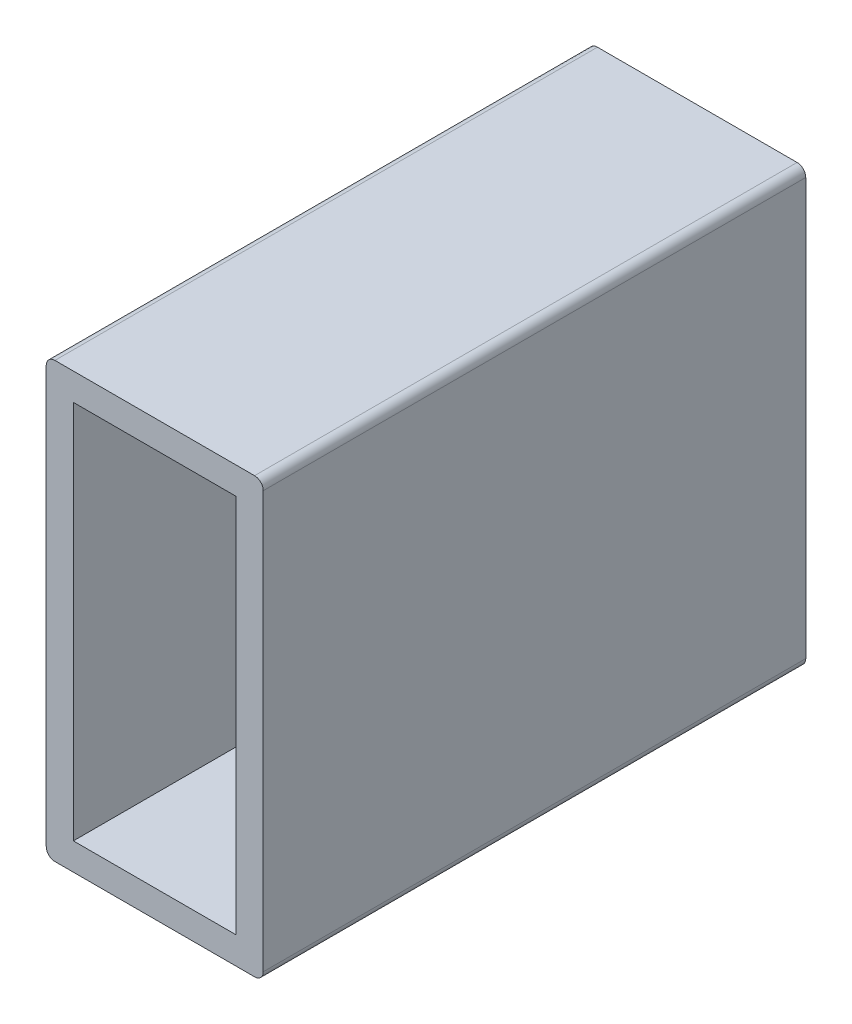
ISO-10303-21;
HEADER;
FILE_DESCRIPTION(('STEP AP214'),'2;1');
FILE_NAME('part.step','',(''),(''),'','','');
FILE_SCHEMA(('AUTOMOTIVE_DESIGN { 1 0 10303 214 1 1 1 1 }'));
ENDSEC;
DATA;
#1=APPLICATION_CONTEXT('core data for automotive mechanical design processes');
#2=APPLICATION_PROTOCOL_DEFINITION('international standard','automotive_design',2000,#1);
#3=PRODUCT_CONTEXT('',#1,'mechanical');
#4=PRODUCT('Part','Part','',(#3));
#5=PRODUCT_RELATED_PRODUCT_CATEGORY('part','',(#4));
#6=PRODUCT_DEFINITION_FORMATION('','',#4);
#7=PRODUCT_DEFINITION_CONTEXT('part definition',#1,'design');
#8=PRODUCT_DEFINITION('design','',#6,#7);
#9=PRODUCT_DEFINITION_SHAPE('','',#8);
#10=(LENGTH_UNIT() NAMED_UNIT(*) SI_UNIT(.MILLI.,.METRE.));
#11=(NAMED_UNIT(*) PLANE_ANGLE_UNIT() SI_UNIT($,.RADIAN.));
#12=(NAMED_UNIT(*) SI_UNIT($,.STERADIAN.) SOLID_ANGLE_UNIT());
#13=UNCERTAINTY_MEASURE_WITH_UNIT(LENGTH_MEASURE(1.E-05),#10,'distance_accuracy_value','');
#14=(GEOMETRIC_REPRESENTATION_CONTEXT(3) GLOBAL_UNCERTAINTY_ASSIGNED_CONTEXT((#13)) GLOBAL_UNIT_ASSIGNED_CONTEXT((#10,
#11,#12)) REPRESENTATION_CONTEXT('',''));
#15=CARTESIAN_POINT('',(0.,0.,0.));
#16=DIRECTION('',(0.,0.,1.));
#17=DIRECTION('',(1.,0.,0.));
#18=AXIS2_PLACEMENT_3D('',#15,#16,#17);
#19=CARTESIAN_POINT('',(-11.684,-24.384,31.75));
#20=DIRECTION('',(0.,0.,1.));
#21=DIRECTION('',(1.,0.,0.));
#22=AXIS2_PLACEMENT_3D('',#19,#20,#21);
#23=PLANE('',#22);
#24=CARTESIAN_POINT('',(-11.684,-24.384,31.75));
#25=DIRECTION('',(0.,0.,1.));
#26=DIRECTION('',(1.,0.,0.));
#27=AXIS2_PLACEMENT_3D('',#24,#25,#26);
#28=CIRCLE('',#27,1.016);
#29=CARTESIAN_POINT('',(-12.7,-24.384,31.75));
#30=VERTEX_POINT('',#29);
#31=CARTESIAN_POINT('',(-11.684,-25.4,31.75));
#32=VERTEX_POINT('',#31);
#33=EDGE_CURVE('E157',#30,#32,#28,.T.);
#34=ORIENTED_EDGE('',*,*,#33,.T.);
#35=DIRECTION('',(1.,0.,0.));
#36=VECTOR('',#35,1.);
#37=CARTESIAN_POINT('',(-11.684,-25.4,31.75));
#38=LINE('',#37,#36);
#39=CARTESIAN_POINT('',(11.684,-25.4,31.75));
#40=VERTEX_POINT('',#39);
#41=EDGE_CURVE('E160',#32,#40,#38,.T.);
#42=ORIENTED_EDGE('',*,*,#41,.T.);
#43=CARTESIAN_POINT('',(11.684,-24.384,31.75));
#44=DIRECTION('',(0.,0.,1.));
#45=DIRECTION('',(1.,0.,0.));
#46=AXIS2_PLACEMENT_3D('',#43,#44,#45);
#47=CIRCLE('',#46,1.016);
#48=CARTESIAN_POINT('',(12.7,-24.384,31.75));
#49=VERTEX_POINT('',#48);
#50=EDGE_CURVE('E163',#40,#49,#47,.T.);
#51=ORIENTED_EDGE('',*,*,#50,.T.);
#52=DIRECTION('',(0.,1.,0.));
#53=VECTOR('',#52,1.);
#54=CARTESIAN_POINT('',(12.7,-24.384,31.75));
#55=LINE('',#54,#53);
#56=CARTESIAN_POINT('',(12.7,24.384,31.75));
#57=VERTEX_POINT('',#56);
#58=EDGE_CURVE('E165',#49,#57,#55,.T.);
#59=ORIENTED_EDGE('',*,*,#58,.T.);
#60=CARTESIAN_POINT('',(11.684,24.384,31.75));
#61=DIRECTION('',(0.,0.,1.));
#62=DIRECTION('',(1.,0.,0.));
#63=AXIS2_PLACEMENT_3D('',#60,#61,#62);
#64=CIRCLE('',#63,1.016);
#65=CARTESIAN_POINT('',(11.684,25.4,31.75));
#66=VERTEX_POINT('',#65);
#67=EDGE_CURVE('E167',#57,#66,#64,.T.);
#68=ORIENTED_EDGE('',*,*,#67,.T.);
#69=DIRECTION('',(-1.,0.,0.));
#70=VECTOR('',#69,1.);
#71=CARTESIAN_POINT('',(-11.684,25.4,31.75));
#72=LINE('',#71,#70);
#73=CARTESIAN_POINT('',(-11.684,25.4,31.75));
#74=VERTEX_POINT('',#73);
#75=EDGE_CURVE('E169',#66,#74,#72,.T.);
#76=ORIENTED_EDGE('',*,*,#75,.T.);
#77=CARTESIAN_POINT('',(-11.684,24.384,31.75));
#78=DIRECTION('',(0.,0.,1.));
#79=DIRECTION('',(1.,0.,0.));
#80=AXIS2_PLACEMENT_3D('',#77,#78,#79);
#81=CIRCLE('',#80,1.016);
#82=CARTESIAN_POINT('',(-12.7,24.384,31.75));
#83=VERTEX_POINT('',#82);
#84=EDGE_CURVE('E171',#74,#83,#81,.T.);
#85=ORIENTED_EDGE('',*,*,#84,.T.);
#86=DIRECTION('',(0.,-1.,0.));
#87=VECTOR('',#86,1.);
#88=CARTESIAN_POINT('',(-12.7,-24.384,31.75));
#89=LINE('',#88,#87);
#90=EDGE_CURVE('E173',#83,#30,#89,.T.);
#91=ORIENTED_EDGE('',*,*,#90,.T.);
#92=EDGE_LOOP('',(#34,#42,#51,#59,#68,#76,#85,#91));
#93=FACE_BOUND('',#92,.T.);
#94=DIRECTION('',(1.,0.,0.));
#95=VECTOR('',#94,1.);
#96=CARTESIAN_POINT('',(-9.525,-22.225,31.75));
#97=LINE('',#96,#95);
#98=CARTESIAN_POINT('',(-9.525,-22.225,31.75));
#99=VERTEX_POINT('',#98);
#100=CARTESIAN_POINT('',(9.525,-22.225,31.75));
#101=VERTEX_POINT('',#100);
#102=EDGE_CURVE('E129',#99,#101,#97,.T.);
#103=ORIENTED_EDGE('',*,*,#102,.F.);
#104=DIRECTION('',(0.,-1.,0.));
#105=VECTOR('',#104,1.);
#106=CARTESIAN_POINT('',(-9.525,-22.225,31.75));
#107=LINE('',#106,#105);
#108=CARTESIAN_POINT('',(-9.525,22.225,31.75));
#109=VERTEX_POINT('',#108);
#110=EDGE_CURVE('E121',#109,#99,#107,.T.);
#111=ORIENTED_EDGE('',*,*,#110,.F.);
#112=DIRECTION('',(-1.,0.,0.));
#113=VECTOR('',#112,1.);
#114=CARTESIAN_POINT('',(-9.525,22.225,31.75));
#115=LINE('',#114,#113);
#116=CARTESIAN_POINT('',(9.525,22.225,31.75));
#117=VERTEX_POINT('',#116);
#118=EDGE_CURVE('E143',#117,#109,#115,.T.);
#119=ORIENTED_EDGE('',*,*,#118,.F.);
#120=DIRECTION('',(0.,1.,0.));
#121=VECTOR('',#120,1.);
#122=CARTESIAN_POINT('',(9.525,-22.225,31.75));
#123=LINE('',#122,#121);
#124=EDGE_CURVE('E141',#101,#117,#123,.T.);
#125=ORIENTED_EDGE('',*,*,#124,.F.);
#126=EDGE_LOOP('',(#103,#111,#119,#125));
#127=FACE_BOUND('',#126,.T.);
#128=ADVANCED_FACE('F32',(#93,#127),#23,.T.);
#129=CARTESIAN_POINT('',(-11.684,-24.384,-31.75));
#130=DIRECTION('',(0.,0.,1.));
#131=DIRECTION('',(1.,0.,0.));
#132=AXIS2_PLACEMENT_3D('',#129,#130,#131);
#133=PLANE('',#132);
#134=CARTESIAN_POINT('',(-11.684,-24.384,-31.75));
#135=DIRECTION('',(0.,0.,1.));
#136=DIRECTION('',(1.,0.,0.));
#137=AXIS2_PLACEMENT_3D('',#134,#135,#136);
#138=CIRCLE('',#137,1.016);
#139=CARTESIAN_POINT('',(-12.7,-24.384,-31.75));
#140=VERTEX_POINT('',#139);
#141=CARTESIAN_POINT('',(-11.684,-25.4,-31.75));
#142=VERTEX_POINT('',#141);
#143=EDGE_CURVE('E137',#140,#142,#138,.T.);
#144=ORIENTED_EDGE('',*,*,#143,.F.);
#145=DIRECTION('',(0.,-1.,0.));
#146=VECTOR('',#145,1.);
#147=CARTESIAN_POINT('',(-12.7,-24.384,-31.75));
#148=LINE('',#147,#146);
#149=CARTESIAN_POINT('',(-12.7,24.384,-31.75));
#150=VERTEX_POINT('',#149);
#151=EDGE_CURVE('E161',#150,#140,#148,.T.);
#152=ORIENTED_EDGE('',*,*,#151,.F.);
#153=CARTESIAN_POINT('',(-11.684,24.384,-31.75));
#154=DIRECTION('',(0.,0.,1.));
#155=DIRECTION('',(1.,0.,0.));
#156=AXIS2_PLACEMENT_3D('',#153,#154,#155);
#157=CIRCLE('',#156,1.016);
#158=CARTESIAN_POINT('',(-11.684,25.4,-31.75));
#159=VERTEX_POINT('',#158);
#160=EDGE_CURVE('E188',#159,#150,#157,.T.);
#161=ORIENTED_EDGE('',*,*,#160,.F.);
#162=DIRECTION('',(-1.,0.,0.));
#163=VECTOR('',#162,1.);
#164=CARTESIAN_POINT('',(-11.684,25.4,-31.75));
#165=LINE('',#164,#163);
#166=CARTESIAN_POINT('',(11.684,25.4,-31.75));
#167=VERTEX_POINT('',#166);
#168=EDGE_CURVE('E186',#167,#159,#165,.T.);
#169=ORIENTED_EDGE('',*,*,#168,.F.);
#170=CARTESIAN_POINT('',(11.684,24.384,-31.75));
#171=DIRECTION('',(0.,0.,1.));
#172=DIRECTION('',(1.,0.,0.));
#173=AXIS2_PLACEMENT_3D('',#170,#171,#172);
#174=CIRCLE('',#173,1.016);
#175=CARTESIAN_POINT('',(12.7,24.384,-31.75));
#176=VERTEX_POINT('',#175);
#177=EDGE_CURVE('E184',#176,#167,#174,.T.);
#178=ORIENTED_EDGE('',*,*,#177,.F.);
#179=DIRECTION('',(0.,1.,0.));
#180=VECTOR('',#179,1.);
#181=CARTESIAN_POINT('',(12.7,-24.384,-31.75));
#182=LINE('',#181,#180);
#183=CARTESIAN_POINT('',(12.7,-24.384,-31.75));
#184=VERTEX_POINT('',#183);
#185=EDGE_CURVE('E182',#184,#176,#182,.T.);
#186=ORIENTED_EDGE('',*,*,#185,.F.);
#187=CARTESIAN_POINT('',(11.684,-24.384,-31.75));
#188=DIRECTION('',(0.,0.,1.));
#189=DIRECTION('',(1.,0.,0.));
#190=AXIS2_PLACEMENT_3D('',#187,#188,#189);
#191=CIRCLE('',#190,1.016);
#192=CARTESIAN_POINT('',(11.684,-25.4,-31.75));
#193=VERTEX_POINT('',#192);
#194=EDGE_CURVE('E180',#193,#184,#191,.T.);
#195=ORIENTED_EDGE('',*,*,#194,.F.);
#196=DIRECTION('',(1.,0.,0.));
#197=VECTOR('',#196,1.);
#198=CARTESIAN_POINT('',(-11.684,-25.4,-31.75));
#199=LINE('',#198,#197);
#200=EDGE_CURVE('E178',#142,#193,#199,.T.);
#201=ORIENTED_EDGE('',*,*,#200,.F.);
#202=EDGE_LOOP('',(#144,#152,#161,#169,#178,#186,#195,#201));
#203=FACE_BOUND('',#202,.T.);
#204=DIRECTION('',(0.,-1.,0.));
#205=VECTOR('',#204,1.);
#206=CARTESIAN_POINT('',(-9.525,-22.225,-31.75));
#207=LINE('',#206,#205);
#208=CARTESIAN_POINT('',(-9.525,22.225,-31.75));
#209=VERTEX_POINT('',#208);
#210=CARTESIAN_POINT('',(-9.525,-22.225,-31.75));
#211=VERTEX_POINT('',#210);
#212=EDGE_CURVE('E55',#209,#211,#207,.T.);
#213=ORIENTED_EDGE('',*,*,#212,.T.);
#214=DIRECTION('',(1.,0.,0.));
#215=VECTOR('',#214,1.);
#216=CARTESIAN_POINT('',(-9.525,-22.225,-31.75));
#217=LINE('',#216,#215);
#218=CARTESIAN_POINT('',(9.525,-22.225,-31.75));
#219=VERTEX_POINT('',#218);
#220=EDGE_CURVE('E136',#211,#219,#217,.T.);
#221=ORIENTED_EDGE('',*,*,#220,.T.);
#222=DIRECTION('',(0.,1.,0.));
#223=VECTOR('',#222,1.);
#224=CARTESIAN_POINT('',(9.525,-22.225,-31.75));
#225=LINE('',#224,#223);
#226=CARTESIAN_POINT('',(9.525,22.225,-31.75));
#227=VERTEX_POINT('',#226);
#228=EDGE_CURVE('E149',#219,#227,#225,.T.);
#229=ORIENTED_EDGE('',*,*,#228,.T.);
#230=DIRECTION('',(-1.,0.,0.));
#231=VECTOR('',#230,1.);
#232=CARTESIAN_POINT('',(-9.525,22.225,-31.75));
#233=LINE('',#232,#231);
#234=EDGE_CURVE('E130',#227,#209,#233,.T.);
#235=ORIENTED_EDGE('',*,*,#234,.T.);
#236=EDGE_LOOP('',(#213,#221,#229,#235));
#237=FACE_BOUND('',#236,.T.);
#238=ADVANCED_FACE('F218',(#203,#237),#133,.F.);
#239=CARTESIAN_POINT('',(-11.684,-24.384,31.75));
#240=DIRECTION('',(0.,0.,-1.));
#241=DIRECTION('',(-1.,0.,0.));
#242=AXIS2_PLACEMENT_3D('',#239,#240,#241);
#243=CYLINDRICAL_SURFACE('',#242,1.016);
#244=ORIENTED_EDGE('',*,*,#143,.T.);
#245=DIRECTION('',(0.,0.,-1.));
#246=VECTOR('',#245,1.);
#247=CARTESIAN_POINT('',(-11.684,-25.4,31.75));
#248=LINE('',#247,#246);
#249=EDGE_CURVE('E11',#32,#142,#248,.T.);
#250=ORIENTED_EDGE('',*,*,#249,.F.);
#251=ORIENTED_EDGE('',*,*,#33,.F.);
#252=DIRECTION('',(0.,0.,-1.));
#253=VECTOR('',#252,1.);
#254=CARTESIAN_POINT('',(-12.7,-24.384,31.75));
#255=LINE('',#254,#253);
#256=EDGE_CURVE('E175',#30,#140,#255,.T.);
#257=ORIENTED_EDGE('',*,*,#256,.T.);
#258=EDGE_LOOP('',(#244,#250,#251,#257));
#259=FACE_BOUND('',#258,.T.);
#260=ADVANCED_FACE('F34',(#259),#243,.T.);
#261=CARTESIAN_POINT('',(-11.684,-25.4,31.75));
#262=DIRECTION('',(0.,1.,0.));
#263=DIRECTION('',(0.,0.,1.));
#264=AXIS2_PLACEMENT_3D('',#261,#262,#263);
#265=PLANE('',#264);
#266=ORIENTED_EDGE('',*,*,#200,.T.);
#267=DIRECTION('',(0.,0.,-1.));
#268=VECTOR('',#267,1.);
#269=CARTESIAN_POINT('',(11.684,-25.4,31.75));
#270=LINE('',#269,#268);
#271=EDGE_CURVE('E40',#40,#193,#270,.T.);
#272=ORIENTED_EDGE('',*,*,#271,.F.);
#273=ORIENTED_EDGE('',*,*,#41,.F.);
#274=ORIENTED_EDGE('',*,*,#249,.T.);
#275=EDGE_LOOP('',(#266,#272,#273,#274));
#276=FACE_BOUND('',#275,.T.);
#277=ADVANCED_FACE('F235',(#276),#265,.F.);
#278=CARTESIAN_POINT('',(11.684,-24.384,31.75));
#279=DIRECTION('',(0.,0.,-1.));
#280=DIRECTION('',(-1.,0.,0.));
#281=AXIS2_PLACEMENT_3D('',#278,#279,#280);
#282=CYLINDRICAL_SURFACE('',#281,1.016);
#283=ORIENTED_EDGE('',*,*,#194,.T.);
#284=DIRECTION('',(0.,0.,-1.));
#285=VECTOR('',#284,1.);
#286=CARTESIAN_POINT('',(12.7,-24.384,31.75));
#287=LINE('',#286,#285);
#288=EDGE_CURVE('E205',#49,#184,#287,.T.);
#289=ORIENTED_EDGE('',*,*,#288,.F.);
#290=ORIENTED_EDGE('',*,*,#50,.F.);
#291=ORIENTED_EDGE('',*,*,#271,.T.);
#292=EDGE_LOOP('',(#283,#289,#290,#291));
#293=FACE_BOUND('',#292,.T.);
#294=ADVANCED_FACE('F212',(#293),#282,.T.);
#295=CARTESIAN_POINT('',(12.7,-24.384,31.75));
#296=DIRECTION('',(-1.,0.,0.));
#297=DIRECTION('',(0.,0.,1.));
#298=AXIS2_PLACEMENT_3D('',#295,#296,#297);
#299=PLANE('',#298);
#300=ORIENTED_EDGE('',*,*,#185,.T.);
#301=DIRECTION('',(0.,0.,-1.));
#302=VECTOR('',#301,1.);
#303=CARTESIAN_POINT('',(12.7,24.384,31.75));
#304=LINE('',#303,#302);
#305=EDGE_CURVE('E202',#57,#176,#304,.T.);
#306=ORIENTED_EDGE('',*,*,#305,.F.);
#307=ORIENTED_EDGE('',*,*,#58,.F.);
#308=ORIENTED_EDGE('',*,*,#288,.T.);
#309=EDGE_LOOP('',(#300,#306,#307,#308));
#310=FACE_BOUND('',#309,.T.);
#311=ADVANCED_FACE('F224',(#310),#299,.F.);
#312=CARTESIAN_POINT('',(11.684,24.384,31.75));
#313=DIRECTION('',(0.,0.,-1.));
#314=DIRECTION('',(-1.,0.,0.));
#315=AXIS2_PLACEMENT_3D('',#312,#313,#314);
#316=CYLINDRICAL_SURFACE('',#315,1.016);
#317=ORIENTED_EDGE('',*,*,#177,.T.);
#318=DIRECTION('',(0.,0.,-1.));
#319=VECTOR('',#318,1.);
#320=CARTESIAN_POINT('',(11.684,25.4,31.75));
#321=LINE('',#320,#319);
#322=EDGE_CURVE('E199',#66,#167,#321,.T.);
#323=ORIENTED_EDGE('',*,*,#322,.F.);
#324=ORIENTED_EDGE('',*,*,#67,.F.);
#325=ORIENTED_EDGE('',*,*,#305,.T.);
#326=EDGE_LOOP('',(#317,#323,#324,#325));
#327=FACE_BOUND('',#326,.T.);
#328=ADVANCED_FACE('F228',(#327),#316,.T.);
#329=CARTESIAN_POINT('',(-11.684,25.4,31.75));
#330=DIRECTION('',(0.,-1.,0.));
#331=DIRECTION('',(0.,0.,-1.));
#332=AXIS2_PLACEMENT_3D('',#329,#330,#331);
#333=PLANE('',#332);
#334=ORIENTED_EDGE('',*,*,#168,.T.);
#335=DIRECTION('',(0.,0.,-1.));
#336=VECTOR('',#335,1.);
#337=CARTESIAN_POINT('',(-11.684,25.4,31.75));
#338=LINE('',#337,#336);
#339=EDGE_CURVE('E196',#74,#159,#338,.T.);
#340=ORIENTED_EDGE('',*,*,#339,.F.);
#341=ORIENTED_EDGE('',*,*,#75,.F.);
#342=ORIENTED_EDGE('',*,*,#322,.T.);
#343=EDGE_LOOP('',(#334,#340,#341,#342));
#344=FACE_BOUND('',#343,.T.);
#345=ADVANCED_FACE('F248',(#344),#333,.F.);
#346=CARTESIAN_POINT('',(-11.684,24.384,31.75));
#347=DIRECTION('',(0.,0.,-1.));
#348=DIRECTION('',(-1.,0.,0.));
#349=AXIS2_PLACEMENT_3D('',#346,#347,#348);
#350=CYLINDRICAL_SURFACE('',#349,1.016);
#351=ORIENTED_EDGE('',*,*,#160,.T.);
#352=DIRECTION('',(0.,0.,-1.));
#353=VECTOR('',#352,1.);
#354=CARTESIAN_POINT('',(-12.7,24.384,31.75));
#355=LINE('',#354,#353);
#356=EDGE_CURVE('E193',#83,#150,#355,.T.);
#357=ORIENTED_EDGE('',*,*,#356,.F.);
#358=ORIENTED_EDGE('',*,*,#84,.F.);
#359=ORIENTED_EDGE('',*,*,#339,.T.);
#360=EDGE_LOOP('',(#351,#357,#358,#359));
#361=FACE_BOUND('',#360,.T.);
#362=ADVANCED_FACE('F246',(#361),#350,.T.);
#363=CARTESIAN_POINT('',(-12.7,-24.384,31.75));
#364=DIRECTION('',(1.,0.,0.));
#365=DIRECTION('',(0.,0.,-1.));
#366=AXIS2_PLACEMENT_3D('',#363,#364,#365);
#367=PLANE('',#366);
#368=ORIENTED_EDGE('',*,*,#151,.T.);
#369=ORIENTED_EDGE('',*,*,#256,.F.);
#370=ORIENTED_EDGE('',*,*,#90,.F.);
#371=ORIENTED_EDGE('',*,*,#356,.T.);
#372=EDGE_LOOP('',(#368,#369,#370,#371));
#373=FACE_BOUND('',#372,.T.);
#374=ADVANCED_FACE('F241',(#373),#367,.F.);
#375=CARTESIAN_POINT('',(-9.525,-22.225,31.75));
#376=DIRECTION('',(1.,0.,0.));
#377=DIRECTION('',(0.,0.,-1.));
#378=AXIS2_PLACEMENT_3D('',#375,#376,#377);
#379=PLANE('',#378);
#380=ORIENTED_EDGE('',*,*,#212,.F.);
#381=DIRECTION('',(0.,0.,-1.));
#382=VECTOR('',#381,1.);
#383=CARTESIAN_POINT('',(-9.525,22.225,31.75));
#384=LINE('',#383,#382);
#385=EDGE_CURVE('E125',#109,#209,#384,.T.);
#386=ORIENTED_EDGE('',*,*,#385,.F.);
#387=ORIENTED_EDGE('',*,*,#110,.T.);
#388=DIRECTION('',(0.,0.,-1.));
#389=VECTOR('',#388,1.);
#390=CARTESIAN_POINT('',(-9.525,-22.225,31.75));
#391=LINE('',#390,#389);
#392=EDGE_CURVE('E124',#99,#211,#391,.T.);
#393=ORIENTED_EDGE('',*,*,#392,.T.);
#394=EDGE_LOOP('',(#380,#386,#387,#393));
#395=FACE_BOUND('',#394,.T.);
#396=ADVANCED_FACE('F123',(#395),#379,.T.);
#397=CARTESIAN_POINT('',(-9.525,-22.225,31.75));
#398=DIRECTION('',(0.,1.,0.));
#399=DIRECTION('',(0.,0.,1.));
#400=AXIS2_PLACEMENT_3D('',#397,#398,#399);
#401=PLANE('',#400);
#402=ORIENTED_EDGE('',*,*,#220,.F.);
#403=ORIENTED_EDGE('',*,*,#392,.F.);
#404=ORIENTED_EDGE('',*,*,#102,.T.);
#405=DIRECTION('',(0.,0.,-1.));
#406=VECTOR('',#405,1.);
#407=CARTESIAN_POINT('',(9.525,-22.225,31.75));
#408=LINE('',#407,#406);
#409=EDGE_CURVE('E138',#101,#219,#408,.T.);
#410=ORIENTED_EDGE('',*,*,#409,.T.);
#411=EDGE_LOOP('',(#402,#403,#404,#410));
#412=FACE_BOUND('',#411,.T.);
#413=ADVANCED_FACE('F133',(#412),#401,.T.);
#414=CARTESIAN_POINT('',(9.525,-22.225,31.75));
#415=DIRECTION('',(-1.,0.,0.));
#416=DIRECTION('',(0.,-1.,0.));
#417=AXIS2_PLACEMENT_3D('',#414,#415,#416);
#418=PLANE('',#417);
#419=ORIENTED_EDGE('',*,*,#228,.F.);
#420=ORIENTED_EDGE('',*,*,#409,.F.);
#421=ORIENTED_EDGE('',*,*,#124,.T.);
#422=DIRECTION('',(0.,0.,-1.));
#423=VECTOR('',#422,1.);
#424=CARTESIAN_POINT('',(9.525,22.225,31.75));
#425=LINE('',#424,#423);
#426=EDGE_CURVE('E47',#117,#227,#425,.T.);
#427=ORIENTED_EDGE('',*,*,#426,.T.);
#428=EDGE_LOOP('',(#419,#420,#421,#427));
#429=FACE_BOUND('',#428,.T.);
#430=ADVANCED_FACE('F273',(#429),#418,.T.);
#431=CARTESIAN_POINT('',(-9.525,22.225,31.75));
#432=DIRECTION('',(0.,-1.,0.));
#433=DIRECTION('',(1.,0.,0.));
#434=AXIS2_PLACEMENT_3D('',#431,#432,#433);
#435=PLANE('',#434);
#436=ORIENTED_EDGE('',*,*,#234,.F.);
#437=ORIENTED_EDGE('',*,*,#426,.F.);
#438=ORIENTED_EDGE('',*,*,#118,.T.);
#439=ORIENTED_EDGE('',*,*,#385,.T.);
#440=EDGE_LOOP('',(#436,#437,#438,#439));
#441=FACE_BOUND('',#440,.T.);
#442=ADVANCED_FACE('F277',(#441),#435,.T.);
#443=CLOSED_SHELL('',(#128,#238,#260,#277,#294,#311,#328,#345,#362,#374,#396,#413,#430,#442));
#444=MANIFOLD_SOLID_BREP('B2',#443);
#445=ADVANCED_BREP_SHAPE_REPRESENTATION('',(#18,#444),#14);
#446=SHAPE_DEFINITION_REPRESENTATION(#9,#445);
ENDSEC;
END-ISO-10303-21;
